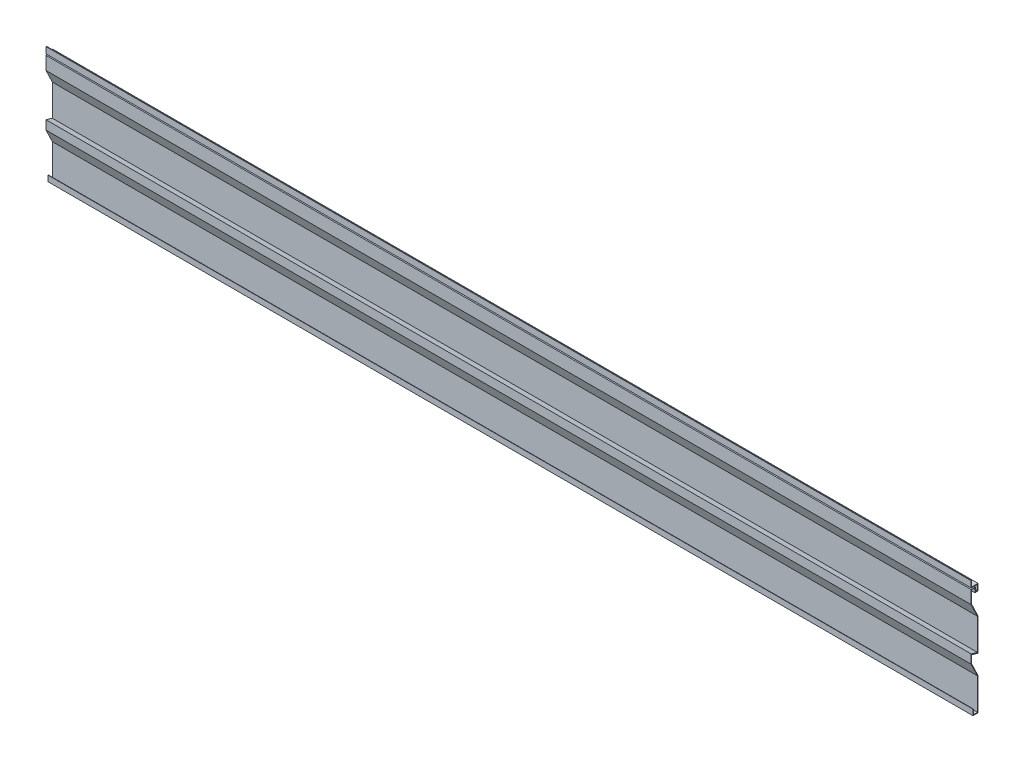
ISO-10303-21;
HEADER;
FILE_DESCRIPTION(('STEP AP214'),'2;1');
FILE_NAME('part.step','',(''),(''),'','','');
FILE_SCHEMA(('AUTOMOTIVE_DESIGN { 1 0 10303 214 1 1 1 1 }'));
ENDSEC;
DATA;
#1=APPLICATION_CONTEXT('core data for automotive mechanical design processes');
#2=APPLICATION_PROTOCOL_DEFINITION('international standard','automotive_design',2000,#1);
#3=PRODUCT_CONTEXT('',#1,'mechanical');
#4=PRODUCT('Part','Part','',(#3));
#5=PRODUCT_RELATED_PRODUCT_CATEGORY('part','',(#4));
#6=PRODUCT_DEFINITION_FORMATION('','',#4);
#7=PRODUCT_DEFINITION_CONTEXT('part definition',#1,'design');
#8=PRODUCT_DEFINITION('design','',#6,#7);
#9=PRODUCT_DEFINITION_SHAPE('','',#8);
#10=(LENGTH_UNIT() NAMED_UNIT(*) SI_UNIT(.MILLI.,.METRE.));
#11=(NAMED_UNIT(*) PLANE_ANGLE_UNIT() SI_UNIT($,.RADIAN.));
#12=(NAMED_UNIT(*) SI_UNIT($,.STERADIAN.) SOLID_ANGLE_UNIT());
#13=UNCERTAINTY_MEASURE_WITH_UNIT(LENGTH_MEASURE(1.E-05),#10,'distance_accuracy_value','');
#14=(GEOMETRIC_REPRESENTATION_CONTEXT(3) GLOBAL_UNCERTAINTY_ASSIGNED_CONTEXT((#13)) GLOBAL_UNIT_ASSIGNED_CONTEXT((#10,
#11,#12)) REPRESENTATION_CONTEXT('',''));
#15=CARTESIAN_POINT('',(0.,0.,0.));
#16=DIRECTION('',(0.,0.,1.));
#17=DIRECTION('',(1.,0.,0.));
#18=AXIS2_PLACEMENT_3D('',#15,#16,#17);
#19=CARTESIAN_POINT('',(1830.,-176.742770169573,21.0404628300535));
#20=DIRECTION('',(0.,0.,-1.));
#21=DIRECTION('',(-1.,0.,0.));
#22=AXIS2_PLACEMENT_3D('',#19,#20,#21);
#23=PLANE('',#22);
#24=DIRECTION('',(0.,-1.,0.));
#25=VECTOR('',#24,1.);
#26=CARTESIAN_POINT('',(0.,-176.742770169573,21.0404628300535));
#27=LINE('',#26,#25);
#28=CARTESIAN_POINT('',(0.,-165.442275203157,21.0404628300535));
#29=VERTEX_POINT('',#28);
#30=CARTESIAN_POINT('',(0.,-176.742770169573,21.0404628300535));
#31=VERTEX_POINT('',#30);
#32=EDGE_CURVE('E278',#29,#31,#27,.T.);
#33=ORIENTED_EDGE('',*,*,#32,.T.);
#34=DIRECTION('',(-1.,0.,0.));
#35=VECTOR('',#34,1.);
#36=CARTESIAN_POINT('',(1830.,-176.742770169573,21.0404628300535));
#37=LINE('',#36,#35);
#38=CARTESIAN_POINT('',(1830.,-176.742770169573,21.0404628300535));
#39=VERTEX_POINT('',#38);
#40=EDGE_CURVE('E11',#39,#31,#37,.T.);
#41=ORIENTED_EDGE('',*,*,#40,.F.);
#42=DIRECTION('',(0.,-1.,0.));
#43=VECTOR('',#42,1.);
#44=CARTESIAN_POINT('',(1830.,-176.742770169573,21.0404628300535));
#45=LINE('',#44,#43);
#46=CARTESIAN_POINT('',(1830.,-165.442275203157,21.0404628300535));
#47=VERTEX_POINT('',#46);
#48=EDGE_CURVE('E340',#47,#39,#45,.T.);
#49=ORIENTED_EDGE('',*,*,#48,.F.);
#50=DIRECTION('',(-1.,0.,0.));
#51=VECTOR('',#50,1.);
#52=CARTESIAN_POINT('',(1830.,-165.442275203157,21.0404628300535));
#53=LINE('',#52,#51);
#54=EDGE_CURVE('E274',#47,#29,#53,.T.);
#55=ORIENTED_EDGE('',*,*,#54,.T.);
#56=EDGE_LOOP('',(#33,#41,#49,#55));
#57=FACE_BOUND('',#56,.T.);
#58=ADVANCED_FACE('F38',(#57),#23,.F.);
#59=CARTESIAN_POINT('',(1830.,-176.742770169573,21.0404628300535));
#60=DIRECTION('',(0.,1.,0.));
#61=DIRECTION('',(0.,0.,1.));
#62=AXIS2_PLACEMENT_3D('',#59,#60,#61);
#63=PLANE('',#62);
#64=DIRECTION('',(0.,0.,-1.));
#65=VECTOR('',#64,1.);
#66=CARTESIAN_POINT('',(0.,-176.742770169573,21.0404628300535));
#67=LINE('',#66,#65);
#68=CARTESIAN_POINT('',(0.,-176.742770169573,11.0404628300535));
#69=VERTEX_POINT('',#68);
#70=EDGE_CURVE('E281',#31,#69,#67,.T.);
#71=ORIENTED_EDGE('',*,*,#70,.T.);
#72=DIRECTION('',(-1.,0.,0.));
#73=VECTOR('',#72,1.);
#74=CARTESIAN_POINT('',(1830.,-176.742770169573,11.0404628300535));
#75=LINE('',#74,#73);
#76=CARTESIAN_POINT('',(1830.,-176.742770169573,11.0404628300535));
#77=VERTEX_POINT('',#76);
#78=EDGE_CURVE('E46',#77,#69,#75,.T.);
#79=ORIENTED_EDGE('',*,*,#78,.F.);
#80=DIRECTION('',(0.,0.,-1.));
#81=VECTOR('',#80,1.);
#82=CARTESIAN_POINT('',(1830.,-176.742770169573,21.0404628300535));
#83=LINE('',#82,#81);
#84=EDGE_CURVE('E169',#39,#77,#83,.T.);
#85=ORIENTED_EDGE('',*,*,#84,.F.);
#86=ORIENTED_EDGE('',*,*,#40,.T.);
#87=EDGE_LOOP('',(#71,#79,#85,#86));
#88=FACE_BOUND('',#87,.T.);
#89=ADVANCED_FACE('F518',(#88),#63,.F.);
#90=CARTESIAN_POINT('',(1830.,-176.742770169573,11.0404628300535));
#91=DIRECTION('',(0.,0.,1.));
#92=DIRECTION('',(1.,0.,0.));
#93=AXIS2_PLACEMENT_3D('',#90,#91,#92);
#94=PLANE('',#93);
#95=DIRECTION('',(0.,1.,0.));
#96=VECTOR('',#95,1.);
#97=CARTESIAN_POINT('',(0.,-176.742770169573,11.0404628300535));
#98=LINE('',#97,#96);
#99=CARTESIAN_POINT('',(0.,-112.742770169573,11.0404628300535));
#100=VERTEX_POINT('',#99);
#101=EDGE_CURVE('E283',#69,#100,#98,.T.);
#102=ORIENTED_EDGE('',*,*,#101,.T.);
#103=DIRECTION('',(-1.,0.,0.));
#104=VECTOR('',#103,1.);
#105=CARTESIAN_POINT('',(1830.,-112.742770169573,11.0404628300535));
#106=LINE('',#105,#104);
#107=CARTESIAN_POINT('',(1830.,-112.742770169573,11.0404628300535));
#108=VERTEX_POINT('',#107);
#109=EDGE_CURVE('E419',#108,#100,#106,.T.);
#110=ORIENTED_EDGE('',*,*,#109,.F.);
#111=DIRECTION('',(0.,1.,0.));
#112=VECTOR('',#111,1.);
#113=CARTESIAN_POINT('',(1830.,-176.742770169573,11.0404628300535));
#114=LINE('',#113,#112);
#115=EDGE_CURVE('E427',#77,#108,#114,.T.);
#116=ORIENTED_EDGE('',*,*,#115,.F.);
#117=ORIENTED_EDGE('',*,*,#78,.T.);
#118=EDGE_LOOP('',(#102,#110,#116,#117));
#119=FACE_BOUND('',#118,.T.);
#120=ADVANCED_FACE('F425',(#119),#94,.F.);
#121=CARTESIAN_POINT('',(1830.,-112.742770169573,11.0404628300535));
#122=DIRECTION('',(0.,-0.430724047871383,0.902483681063148));
#123=DIRECTION('',(0.,-0.902483681063148,-0.430724047871383));
#124=AXIS2_PLACEMENT_3D('',#121,#122,#123);
#125=PLANE('',#124);
#126=DIRECTION('',(0.,0.902483681063148,0.430724047871383));
#127=VECTOR('',#126,1.);
#128=CARTESIAN_POINT('',(0.,-112.742770169573,11.0404628300535));
#129=LINE('',#128,#127);
#130=CARTESIAN_POINT('',(0.,-86.7468857968479,23.4473935923095));
#131=VERTEX_POINT('',#130);
#132=EDGE_CURVE('E285',#100,#131,#129,.T.);
#133=ORIENTED_EDGE('',*,*,#132,.T.);
#134=DIRECTION('',(-1.,0.,0.));
#135=VECTOR('',#134,1.);
#136=CARTESIAN_POINT('',(1830.,-86.7468857968479,23.4473935923095));
#137=LINE('',#136,#135);
#138=CARTESIAN_POINT('',(1830.,-86.7468857968479,23.4473935923095));
#139=VERTEX_POINT('',#138);
#140=EDGE_CURVE('E416',#139,#131,#137,.T.);
#141=ORIENTED_EDGE('',*,*,#140,.F.);
#142=DIRECTION('',(0.,0.902483681063148,0.430724047871383));
#143=VECTOR('',#142,1.);
#144=CARTESIAN_POINT('',(1830.,-112.742770169573,11.0404628300535));
#145=LINE('',#144,#143);
#146=EDGE_CURVE('E445',#108,#139,#145,.T.);
#147=ORIENTED_EDGE('',*,*,#146,.F.);
#148=ORIENTED_EDGE('',*,*,#109,.T.);
#149=EDGE_LOOP('',(#133,#141,#147,#148));
#150=FACE_BOUND('',#149,.T.);
#151=ADVANCED_FACE('F436',(#150),#125,.F.);
#152=CARTESIAN_POINT('',(1830.,-86.7468857968479,23.4473935923095));
#153=DIRECTION('',(0.,0.,1.));
#154=DIRECTION('',(1.,0.,0.));
#155=AXIS2_PLACEMENT_3D('',#152,#153,#154);
#156=PLANE('',#155);
#157=DIRECTION('',(0.,1.,0.));
#158=VECTOR('',#157,1.);
#159=CARTESIAN_POINT('',(0.,-86.7468857968479,23.4473935923095));
#160=LINE('',#159,#158);
#161=CARTESIAN_POINT('',(0.,-71.1496014100118,23.4473935923095));
#162=VERTEX_POINT('',#161);
#163=EDGE_CURVE('E287',#131,#162,#160,.T.);
#164=ORIENTED_EDGE('',*,*,#163,.T.);
#165=DIRECTION('',(-1.,0.,0.));
#166=VECTOR('',#165,1.);
#167=CARTESIAN_POINT('',(1830.,-71.1496014100118,23.4473935923095));
#168=LINE('',#167,#166);
#169=CARTESIAN_POINT('',(1830.,-71.1496014100118,23.4473935923095));
#170=VERTEX_POINT('',#169);
#171=EDGE_CURVE('E413',#170,#162,#168,.T.);
#172=ORIENTED_EDGE('',*,*,#171,.F.);
#173=DIRECTION('',(0.,1.,0.));
#174=VECTOR('',#173,1.);
#175=CARTESIAN_POINT('',(1830.,-86.7468857968479,23.4473935923095));
#176=LINE('',#175,#174);
#177=EDGE_CURVE('E442',#139,#170,#176,.T.);
#178=ORIENTED_EDGE('',*,*,#177,.F.);
#179=ORIENTED_EDGE('',*,*,#140,.T.);
#180=EDGE_LOOP('',(#164,#172,#178,#179));
#181=FACE_BOUND('',#180,.T.);
#182=ADVANCED_FACE('F440',(#181),#156,.F.);
#183=CARTESIAN_POINT('',(1830.,-71.1496014100118,23.4473935923095));
#184=DIRECTION('',(0.,0.961523947640823,-0.274721127897377));
#185=DIRECTION('',(0.,0.274721127897377,0.961523947640823));
#186=AXIS2_PLACEMENT_3D('',#183,#184,#185);
#187=PLANE('',#186);
#188=DIRECTION('',(0.,-0.274721127897377,-0.961523947640823));
#189=VECTOR('',#188,1.);
#190=CARTESIAN_POINT('',(0.,-71.1496014100118,23.4473935923095));
#191=LINE('',#190,#189);
#192=CARTESIAN_POINT('',(0.,-74.6944387706563,11.0404628300535));
#193=VERTEX_POINT('',#192);
#194=EDGE_CURVE('E289',#162,#193,#191,.T.);
#195=ORIENTED_EDGE('',*,*,#194,.T.);
#196=DIRECTION('',(-1.,0.,0.));
#197=VECTOR('',#196,1.);
#198=CARTESIAN_POINT('',(1830.,-74.6944387706563,11.0404628300535));
#199=LINE('',#198,#197);
#200=CARTESIAN_POINT('',(1830.,-74.6944387706563,11.0404628300535));
#201=VERTEX_POINT('',#200);
#202=EDGE_CURVE('E410',#201,#193,#199,.T.);
#203=ORIENTED_EDGE('',*,*,#202,.F.);
#204=DIRECTION('',(0.,-0.274721127897377,-0.961523947640823));
#205=VECTOR('',#204,1.);
#206=CARTESIAN_POINT('',(1830.,-71.1496014100118,23.4473935923095));
#207=LINE('',#206,#205);
#208=EDGE_CURVE('E444',#170,#201,#207,.T.);
#209=ORIENTED_EDGE('',*,*,#208,.F.);
#210=ORIENTED_EDGE('',*,*,#171,.T.);
#211=EDGE_LOOP('',(#195,#203,#209,#210));
#212=FACE_BOUND('',#211,.T.);
#213=ADVANCED_FACE('F531',(#212),#187,.F.);
#214=CARTESIAN_POINT('',(1830.,-74.6944387706563,11.0404628300535));
#215=DIRECTION('',(0.,0.,1.));
#216=DIRECTION('',(1.,0.,0.));
#217=AXIS2_PLACEMENT_3D('',#214,#215,#216);
#218=PLANE('',#217);
#219=DIRECTION('',(0.,1.,0.));
#220=VECTOR('',#219,1.);
#221=CARTESIAN_POINT('',(0.,-74.6944387706563,11.0404628300535));
#222=LINE('',#221,#220);
#223=CARTESIAN_POINT('',(0.,-10.6944387706563,11.0404628300535));
#224=VERTEX_POINT('',#223);
#225=EDGE_CURVE('E291',#193,#224,#222,.T.);
#226=ORIENTED_EDGE('',*,*,#225,.T.);
#227=DIRECTION('',(-1.,0.,0.));
#228=VECTOR('',#227,1.);
#229=CARTESIAN_POINT('',(1830.,-10.6944387706563,11.0404628300535));
#230=LINE('',#229,#228);
#231=CARTESIAN_POINT('',(1830.,-10.6944387706563,11.0404628300535));
#232=VERTEX_POINT('',#231);
#233=EDGE_CURVE('E407',#232,#224,#230,.T.);
#234=ORIENTED_EDGE('',*,*,#233,.F.);
#235=DIRECTION('',(0.,1.,0.));
#236=VECTOR('',#235,1.);
#237=CARTESIAN_POINT('',(1830.,-74.6944387706563,11.0404628300535));
#238=LINE('',#237,#236);
#239=EDGE_CURVE('E447',#201,#232,#238,.T.);
#240=ORIENTED_EDGE('',*,*,#239,.F.);
#241=ORIENTED_EDGE('',*,*,#202,.T.);
#242=EDGE_LOOP('',(#226,#234,#240,#241));
#243=FACE_BOUND('',#242,.T.);
#244=ADVANCED_FACE('F534',(#243),#218,.F.);
#245=CARTESIAN_POINT('',(1830.,-10.6944387706563,11.0404628300535));
#246=DIRECTION('',(0.,-0.430724047871383,0.902483681063148));
#247=DIRECTION('',(0.,-0.902483681063148,-0.430724047871384));
#248=AXIS2_PLACEMENT_3D('',#245,#246,#247);
#249=PLANE('',#248);
#250=DIRECTION('',(0.,0.902483681063148,0.430724047871383));
#251=VECTOR('',#250,1.);
#252=CARTESIAN_POINT('',(0.,-10.6944387706563,11.0404628300535));
#253=LINE('',#252,#251);
#254=CARTESIAN_POINT('',(0.,15.3014456020684,23.4473935923095));
#255=VERTEX_POINT('',#254);
#256=EDGE_CURVE('E293',#224,#255,#253,.T.);
#257=ORIENTED_EDGE('',*,*,#256,.T.);
#258=DIRECTION('',(-1.,0.,0.));
#259=VECTOR('',#258,1.);
#260=CARTESIAN_POINT('',(1830.,15.3014456020684,23.4473935923095));
#261=LINE('',#260,#259);
#262=CARTESIAN_POINT('',(1830.,15.3014456020684,23.4473935923095));
#263=VERTEX_POINT('',#262);
#264=EDGE_CURVE('E404',#263,#255,#261,.T.);
#265=ORIENTED_EDGE('',*,*,#264,.F.);
#266=DIRECTION('',(0.,0.902483681063148,0.430724047871383));
#267=VECTOR('',#266,1.);
#268=CARTESIAN_POINT('',(1830.,-10.6944387706563,11.0404628300535));
#269=LINE('',#268,#267);
#270=EDGE_CURVE('E453',#232,#263,#269,.T.);
#271=ORIENTED_EDGE('',*,*,#270,.F.);
#272=ORIENTED_EDGE('',*,*,#233,.T.);
#273=EDGE_LOOP('',(#257,#265,#271,#272));
#274=FACE_BOUND('',#273,.T.);
#275=ADVANCED_FACE('F538',(#274),#249,.F.);
#276=CARTESIAN_POINT('',(1830.,15.3014456020684,23.4473935923095));
#277=DIRECTION('',(0.,0.,1.));
#278=DIRECTION('',(1.,0.,0.));
#279=AXIS2_PLACEMENT_3D('',#276,#277,#278);
#280=PLANE('',#279);
#281=DIRECTION('',(0.,1.,0.));
#282=VECTOR('',#281,1.);
#283=CARTESIAN_POINT('',(0.,15.3014456020684,23.4473935923095));
#284=LINE('',#283,#282);
#285=CARTESIAN_POINT('',(0.,40.3055612293437,23.4473935923095));
#286=VERTEX_POINT('',#285);
#287=EDGE_CURVE('E295',#255,#286,#284,.T.);
#288=ORIENTED_EDGE('',*,*,#287,.T.);
#289=DIRECTION('',(-1.,0.,0.));
#290=VECTOR('',#289,1.);
#291=CARTESIAN_POINT('',(1830.,40.3055612293437,23.4473935923095));
#292=LINE('',#291,#290);
#293=CARTESIAN_POINT('',(1830.,40.3055612293437,23.4473935923095));
#294=VERTEX_POINT('',#293);
#295=EDGE_CURVE('E401',#294,#286,#292,.T.);
#296=ORIENTED_EDGE('',*,*,#295,.F.);
#297=DIRECTION('',(0.,1.,0.));
#298=VECTOR('',#297,1.);
#299=CARTESIAN_POINT('',(1830.,15.3014456020684,23.4473935923095));
#300=LINE('',#299,#298);
#301=EDGE_CURVE('E455',#263,#294,#300,.T.);
#302=ORIENTED_EDGE('',*,*,#301,.F.);
#303=ORIENTED_EDGE('',*,*,#264,.T.);
#304=EDGE_LOOP('',(#288,#296,#302,#303));
#305=FACE_BOUND('',#304,.T.);
#306=ADVANCED_FACE('F542',(#305),#280,.F.);
#307=CARTESIAN_POINT('',(1830.,40.3055612293437,23.4473935923095));
#308=DIRECTION('',(0.,1.,0.));
#309=DIRECTION('',(0.,0.,1.));
#310=AXIS2_PLACEMENT_3D('',#307,#308,#309);
#311=PLANE('',#310);
#312=DIRECTION('',(0.,0.,-1.));
#313=VECTOR('',#312,1.);
#314=CARTESIAN_POINT('',(0.,40.3055612293437,23.4473935923095));
#315=LINE('',#314,#313);
#316=CARTESIAN_POINT('',(0.,40.3055612293437,17.2439282111815));
#317=VERTEX_POINT('',#316);
#318=EDGE_CURVE('E297',#286,#317,#315,.T.);
#319=ORIENTED_EDGE('',*,*,#318,.T.);
#320=DIRECTION('',(-1.,0.,0.));
#321=VECTOR('',#320,1.);
#322=CARTESIAN_POINT('',(1830.,40.3055612293437,17.2439282111815));
#323=LINE('',#322,#321);
#324=CARTESIAN_POINT('',(1830.,40.3055612293437,17.2439282111815));
#325=VERTEX_POINT('',#324);
#326=EDGE_CURVE('E398',#325,#317,#323,.T.);
#327=ORIENTED_EDGE('',*,*,#326,.F.);
#328=DIRECTION('',(0.,0.,-1.));
#329=VECTOR('',#328,1.);
#330=CARTESIAN_POINT('',(1830.,40.3055612293437,23.4473935923095));
#331=LINE('',#330,#329);
#332=EDGE_CURVE('E457',#294,#325,#331,.T.);
#333=ORIENTED_EDGE('',*,*,#332,.F.);
#334=ORIENTED_EDGE('',*,*,#295,.T.);
#335=EDGE_LOOP('',(#319,#327,#333,#334));
#336=FACE_BOUND('',#335,.T.);
#337=ADVANCED_FACE('F546',(#336),#311,.F.);
#338=CARTESIAN_POINT('',(1830.,40.3055612293437,17.2439282111815));
#339=DIRECTION('',(0.,0.,-1.));
#340=DIRECTION('',(-1.,0.,0.));
#341=AXIS2_PLACEMENT_3D('',#338,#339,#340);
#342=PLANE('',#341);
#343=DIRECTION('',(0.,-1.,0.));
#344=VECTOR('',#343,1.);
#345=CARTESIAN_POINT('',(0.,40.3055612293437,17.2439282111815));
#346=LINE('',#345,#344);
#347=CARTESIAN_POINT('',(0.,32.0051657847453,17.2439282111815));
#348=VERTEX_POINT('',#347);
#349=EDGE_CURVE('E299',#317,#348,#346,.T.);
#350=ORIENTED_EDGE('',*,*,#349,.T.);
#351=DIRECTION('',(-1.,0.,0.));
#352=VECTOR('',#351,1.);
#353=CARTESIAN_POINT('',(1830.,32.0051657847453,17.2439282111815));
#354=LINE('',#353,#352);
#355=CARTESIAN_POINT('',(1830.,32.0051657847453,17.2439282111815));
#356=VERTEX_POINT('',#355);
#357=EDGE_CURVE('E395',#356,#348,#354,.T.);
#358=ORIENTED_EDGE('',*,*,#357,.F.);
#359=DIRECTION('',(0.,-1.,0.));
#360=VECTOR('',#359,1.);
#361=CARTESIAN_POINT('',(1830.,40.3055612293437,17.2439282111815));
#362=LINE('',#361,#360);
#363=EDGE_CURVE('E459',#325,#356,#362,.T.);
#364=ORIENTED_EDGE('',*,*,#363,.F.);
#365=ORIENTED_EDGE('',*,*,#326,.T.);
#366=EDGE_LOOP('',(#350,#358,#364,#365));
#367=FACE_BOUND('',#366,.T.);
#368=ADVANCED_FACE('F550',(#367),#342,.F.);
#369=CARTESIAN_POINT('',(1830.,32.0051657847453,17.2439282111815));
#370=DIRECTION('',(0.,1.,0.));
#371=DIRECTION('',(0.,0.,1.));
#372=AXIS2_PLACEMENT_3D('',#369,#370,#371);
#373=PLANE('',#372);
#374=DIRECTION('',(0.,0.,-1.));
#375=VECTOR('',#374,1.);
#376=CARTESIAN_POINT('',(0.,32.0051657847453,17.2439282111815));
#377=LINE('',#376,#375);
#378=CARTESIAN_POINT('',(0.,32.0051657847453,11.0404628300535));
#379=VERTEX_POINT('',#378);
#380=EDGE_CURVE('E301',#348,#379,#377,.T.);
#381=ORIENTED_EDGE('',*,*,#380,.T.);
#382=DIRECTION('',(-1.,0.,0.));
#383=VECTOR('',#382,1.);
#384=CARTESIAN_POINT('',(1830.,32.0051657847453,11.0404628300535));
#385=LINE('',#384,#383);
#386=CARTESIAN_POINT('',(1830.,32.0051657847453,11.0404628300535));
#387=VERTEX_POINT('',#386);
#388=EDGE_CURVE('E392',#387,#379,#385,.T.);
#389=ORIENTED_EDGE('',*,*,#388,.F.);
#390=DIRECTION('',(0.,0.,-1.));
#391=VECTOR('',#390,1.);
#392=CARTESIAN_POINT('',(1830.,32.0051657847453,17.2439282111815));
#393=LINE('',#392,#391);
#394=EDGE_CURVE('E461',#356,#387,#393,.T.);
#395=ORIENTED_EDGE('',*,*,#394,.F.);
#396=ORIENTED_EDGE('',*,*,#357,.T.);
#397=EDGE_LOOP('',(#381,#389,#395,#396));
#398=FACE_BOUND('',#397,.T.);
#399=ADVANCED_FACE('F554',(#398),#373,.F.);
#400=CARTESIAN_POINT('',(1830.,32.0051657847453,11.0404628300535));
#401=DIRECTION('',(0.,0.,1.));
#402=DIRECTION('',(1.,0.,0.));
#403=AXIS2_PLACEMENT_3D('',#400,#401,#402);
#404=PLANE('',#403);
#405=DIRECTION('',(0.,1.,0.));
#406=VECTOR('',#405,1.);
#407=CARTESIAN_POINT('',(0.,32.0051657847453,11.0404628300535));
#408=LINE('',#407,#406);
#409=CARTESIAN_POINT('',(0.,45.1210640191303,11.0404628300535));
#410=VERTEX_POINT('',#409);
#411=EDGE_CURVE('E303',#379,#410,#408,.T.);
#412=ORIENTED_EDGE('',*,*,#411,.T.);
#413=DIRECTION('',(-1.,0.,0.));
#414=VECTOR('',#413,1.);
#415=CARTESIAN_POINT('',(1830.,45.1210640191303,11.0404628300535));
#416=LINE('',#415,#414);
#417=CARTESIAN_POINT('',(1830.,45.1210640191303,11.0404628300535));
#418=VERTEX_POINT('',#417);
#419=EDGE_CURVE('E389',#418,#410,#416,.T.);
#420=ORIENTED_EDGE('',*,*,#419,.F.);
#421=DIRECTION('',(0.,1.,0.));
#422=VECTOR('',#421,1.);
#423=CARTESIAN_POINT('',(1830.,32.0051657847453,11.0404628300535));
#424=LINE('',#423,#422);
#425=EDGE_CURVE('E463',#387,#418,#424,.T.);
#426=ORIENTED_EDGE('',*,*,#425,.F.);
#427=ORIENTED_EDGE('',*,*,#388,.T.);
#428=EDGE_LOOP('',(#412,#420,#426,#427));
#429=FACE_BOUND('',#428,.T.);
#430=ADVANCED_FACE('F558',(#429),#404,.F.);
#431=CARTESIAN_POINT('',(1830.,45.1210640191303,11.0404628300535));
#432=DIRECTION('',(0.,-1.,0.));
#433=DIRECTION('',(0.,0.,-1.));
#434=AXIS2_PLACEMENT_3D('',#431,#432,#433);
#435=PLANE('',#434);
#436=DIRECTION('',(0.,0.,1.));
#437=VECTOR('',#436,1.);
#438=CARTESIAN_POINT('',(0.,45.1210640191303,11.0404628300535));
#439=LINE('',#438,#437);
#440=CARTESIAN_POINT('',(0.,45.1210640191303,23.4473935923095));
#441=VERTEX_POINT('',#440);
#442=EDGE_CURVE('E305',#410,#441,#439,.T.);
#443=ORIENTED_EDGE('',*,*,#442,.T.);
#444=DIRECTION('',(-1.,0.,0.));
#445=VECTOR('',#444,1.);
#446=CARTESIAN_POINT('',(1830.,45.1210640191303,23.4473935923095));
#447=LINE('',#446,#445);
#448=CARTESIAN_POINT('',(1830.,45.1210640191303,23.4473935923095));
#449=VERTEX_POINT('',#448);
#450=EDGE_CURVE('E386',#449,#441,#447,.T.);
#451=ORIENTED_EDGE('',*,*,#450,.F.);
#452=DIRECTION('',(0.,0.,1.));
#453=VECTOR('',#452,1.);
#454=CARTESIAN_POINT('',(1830.,45.1210640191303,11.0404628300535));
#455=LINE('',#454,#453);
#456=EDGE_CURVE('E465',#418,#449,#455,.T.);
#457=ORIENTED_EDGE('',*,*,#456,.F.);
#458=ORIENTED_EDGE('',*,*,#419,.T.);
#459=EDGE_LOOP('',(#443,#451,#457,#458));
#460=FACE_BOUND('',#459,.T.);
#461=ADVANCED_FACE('F562',(#460),#435,.F.);
#462=CARTESIAN_POINT('',(1830.,45.1210640191303,23.4473935923095));
#463=DIRECTION('',(0.,0.,1.));
#464=DIRECTION('',(1.,0.,0.));
#465=AXIS2_PLACEMENT_3D('',#462,#463,#464);
#466=PLANE('',#465);
#467=DIRECTION('',(0.,1.,0.));
#468=VECTOR('',#467,1.);
#469=CARTESIAN_POINT('',(0.,45.1210640191303,23.4473935923095));
#470=LINE('',#469,#468);
#471=CARTESIAN_POINT('',(0.,56.3055612293437,23.4473935923095));
#472=VERTEX_POINT('',#471);
#473=EDGE_CURVE('E307',#441,#472,#470,.T.);
#474=ORIENTED_EDGE('',*,*,#473,.T.);
#475=DIRECTION('',(-1.,0.,0.));
#476=VECTOR('',#475,1.);
#477=CARTESIAN_POINT('',(1830.,56.3055612293437,23.4473935923095));
#478=LINE('',#477,#476);
#479=CARTESIAN_POINT('',(1830.,56.3055612293437,23.4473935923095));
#480=VERTEX_POINT('',#479);
#481=EDGE_CURVE('E383',#480,#472,#478,.T.);
#482=ORIENTED_EDGE('',*,*,#481,.F.);
#483=DIRECTION('',(0.,1.,0.));
#484=VECTOR('',#483,1.);
#485=CARTESIAN_POINT('',(1830.,45.1210640191303,23.4473935923095));
#486=LINE('',#485,#484);
#487=EDGE_CURVE('E467',#449,#480,#486,.T.);
#488=ORIENTED_EDGE('',*,*,#487,.F.);
#489=ORIENTED_EDGE('',*,*,#450,.T.);
#490=EDGE_LOOP('',(#474,#482,#488,#489));
#491=FACE_BOUND('',#490,.T.);
#492=ADVANCED_FACE('F566',(#491),#466,.F.);
#493=CARTESIAN_POINT('',(1830.,56.3055612293437,24.5071196606439));
#494=DIRECTION('',(0.,-1.,0.));
#495=DIRECTION('',(0.,0.,-1.));
#496=AXIS2_PLACEMENT_3D('',#493,#494,#495);
#497=PLANE('',#496);
#498=DIRECTION('',(0.,0.,1.));
#499=VECTOR('',#498,1.);
#500=CARTESIAN_POINT('',(0.,56.3055612293437,24.5071196606439));
#501=LINE('',#500,#499);
#502=CARTESIAN_POINT('',(0.,56.3055612293437,24.5071196606439));
#503=VERTEX_POINT('',#502);
#504=EDGE_CURVE('E309',#472,#503,#501,.T.);
#505=ORIENTED_EDGE('',*,*,#504,.T.);
#506=DIRECTION('',(-1.,0.,0.));
#507=VECTOR('',#506,1.);
#508=CARTESIAN_POINT('',(1830.,56.3055612293437,24.5071196606439));
#509=LINE('',#508,#507);
#510=CARTESIAN_POINT('',(1830.,56.3055612293437,24.5071196606439));
#511=VERTEX_POINT('',#510);
#512=EDGE_CURVE('E380',#511,#503,#509,.T.);
#513=ORIENTED_EDGE('',*,*,#512,.F.);
#514=DIRECTION('',(0.,0.,1.));
#515=VECTOR('',#514,1.);
#516=CARTESIAN_POINT('',(1830.,56.3055612293437,24.5071196606439));
#517=LINE('',#516,#515);
#518=EDGE_CURVE('E469',#480,#511,#517,.T.);
#519=ORIENTED_EDGE('',*,*,#518,.F.);
#520=ORIENTED_EDGE('',*,*,#481,.T.);
#521=EDGE_LOOP('',(#505,#513,#519,#520));
#522=FACE_BOUND('',#521,.T.);
#523=ADVANCED_FACE('F570',(#522),#497,.F.);
#524=CARTESIAN_POINT('',(1830.,43.8204378839902,24.5071196606439));
#525=DIRECTION('',(0.,0.,-1.));
#526=DIRECTION('',(-1.,0.,0.));
#527=AXIS2_PLACEMENT_3D('',#524,#525,#526);
#528=PLANE('',#527);
#529=DIRECTION('',(0.,-1.,0.));
#530=VECTOR('',#529,1.);
#531=CARTESIAN_POINT('',(0.,43.8204378839902,24.5071196606439));
#532=LINE('',#531,#530);
#533=CARTESIAN_POINT('',(0.,43.8204378839902,24.5071196606439));
#534=VERTEX_POINT('',#533);
#535=EDGE_CURVE('E311',#503,#534,#532,.T.);
#536=ORIENTED_EDGE('',*,*,#535,.T.);
#537=DIRECTION('',(-1.,0.,0.));
#538=VECTOR('',#537,1.);
#539=CARTESIAN_POINT('',(1830.,43.8204378839902,24.5071196606439));
#540=LINE('',#539,#538);
#541=CARTESIAN_POINT('',(1830.,43.8204378839902,24.5071196606439));
#542=VERTEX_POINT('',#541);
#543=EDGE_CURVE('E377',#542,#534,#540,.T.);
#544=ORIENTED_EDGE('',*,*,#543,.F.);
#545=DIRECTION('',(0.,-1.,0.));
#546=VECTOR('',#545,1.);
#547=CARTESIAN_POINT('',(1830.,43.8204378839902,24.5071196606439));
#548=LINE('',#547,#546);
#549=EDGE_CURVE('E471',#511,#542,#548,.T.);
#550=ORIENTED_EDGE('',*,*,#549,.F.);
#551=ORIENTED_EDGE('',*,*,#512,.T.);
#552=EDGE_LOOP('',(#536,#544,#550,#551));
#553=FACE_BOUND('',#552,.T.);
#554=ADVANCED_FACE('F574',(#553),#528,.F.);
#555=CARTESIAN_POINT('',(1830.,43.8204378839902,12.1001888983879));
#556=DIRECTION('',(0.,1.,0.));
#557=DIRECTION('',(0.,0.,1.));
#558=AXIS2_PLACEMENT_3D('',#555,#556,#557);
#559=PLANE('',#558);
#560=DIRECTION('',(0.,0.,-1.));
#561=VECTOR('',#560,1.);
#562=CARTESIAN_POINT('',(0.,43.8204378839902,12.1001888983879));
#563=LINE('',#562,#561);
#564=CARTESIAN_POINT('',(0.,43.8204378839902,12.1001888983879));
#565=VERTEX_POINT('',#564);
#566=EDGE_CURVE('E313',#534,#565,#563,.T.);
#567=ORIENTED_EDGE('',*,*,#566,.T.);
#568=DIRECTION('',(-1.,0.,0.));
#569=VECTOR('',#568,1.);
#570=CARTESIAN_POINT('',(1830.,43.8204378839902,12.1001888983879));
#571=LINE('',#570,#569);
#572=CARTESIAN_POINT('',(1830.,43.8204378839902,12.1001888983879));
#573=VERTEX_POINT('',#572);
#574=EDGE_CURVE('E374',#573,#565,#571,.T.);
#575=ORIENTED_EDGE('',*,*,#574,.F.);
#576=DIRECTION('',(0.,0.,-1.));
#577=VECTOR('',#576,1.);
#578=CARTESIAN_POINT('',(1830.,43.8204378839902,12.1001888983879));
#579=LINE('',#578,#577);
#580=EDGE_CURVE('E473',#542,#573,#579,.T.);
#581=ORIENTED_EDGE('',*,*,#580,.F.);
#582=ORIENTED_EDGE('',*,*,#543,.T.);
#583=EDGE_LOOP('',(#567,#575,#581,#582));
#584=FACE_BOUND('',#583,.T.);
#585=ADVANCED_FACE('F578',(#584),#559,.F.);
#586=CARTESIAN_POINT('',(1830.,33.361087921631,12.1001888983879));
#587=DIRECTION('',(0.,0.,-1.));
#588=DIRECTION('',(-1.,0.,0.));
#589=AXIS2_PLACEMENT_3D('',#586,#587,#588);
#590=PLANE('',#589);
#591=DIRECTION('',(0.,-1.,0.));
#592=VECTOR('',#591,1.);
#593=CARTESIAN_POINT('',(0.,33.361087921631,12.1001888983879));
#594=LINE('',#593,#592);
#595=CARTESIAN_POINT('',(0.,33.361087921631,12.1001888983879));
#596=VERTEX_POINT('',#595);
#597=EDGE_CURVE('E315',#565,#596,#594,.T.);
#598=ORIENTED_EDGE('',*,*,#597,.T.);
#599=DIRECTION('',(-1.,0.,0.));
#600=VECTOR('',#599,1.);
#601=CARTESIAN_POINT('',(1830.,33.361087921631,12.1001888983879));
#602=LINE('',#601,#600);
#603=CARTESIAN_POINT('',(1830.,33.361087921631,12.1001888983879));
#604=VERTEX_POINT('',#603);
#605=EDGE_CURVE('E371',#604,#596,#602,.T.);
#606=ORIENTED_EDGE('',*,*,#605,.F.);
#607=DIRECTION('',(0.,-1.,0.));
#608=VECTOR('',#607,1.);
#609=CARTESIAN_POINT('',(1830.,33.361087921631,12.1001888983879));
#610=LINE('',#609,#608);
#611=EDGE_CURVE('E475',#573,#604,#610,.T.);
#612=ORIENTED_EDGE('',*,*,#611,.F.);
#613=ORIENTED_EDGE('',*,*,#574,.T.);
#614=EDGE_LOOP('',(#598,#606,#612,#613));
#615=FACE_BOUND('',#614,.T.);
#616=ADVANCED_FACE('F582',(#615),#590,.F.);
#617=CARTESIAN_POINT('',(1830.,33.361087921631,16.2229249000667));
#618=DIRECTION('',(0.,-1.,0.));
#619=DIRECTION('',(0.,0.,-1.));
#620=AXIS2_PLACEMENT_3D('',#617,#618,#619);
#621=PLANE('',#620);
#622=DIRECTION('',(0.,0.,1.));
#623=VECTOR('',#622,1.);
#624=CARTESIAN_POINT('',(0.,33.361087921631,16.2229249000667));
#625=LINE('',#624,#623);
#626=CARTESIAN_POINT('',(0.,33.361087921631,16.2229249000667));
#627=VERTEX_POINT('',#626);
#628=EDGE_CURVE('E317',#596,#627,#625,.T.);
#629=ORIENTED_EDGE('',*,*,#628,.T.);
#630=DIRECTION('',(-1.,0.,0.));
#631=VECTOR('',#630,1.);
#632=CARTESIAN_POINT('',(1830.,33.361087921631,16.2229249000667));
#633=LINE('',#632,#631);
#634=CARTESIAN_POINT('',(1830.,33.361087921631,16.2229249000667));
#635=VERTEX_POINT('',#634);
#636=EDGE_CURVE('E368',#635,#627,#633,.T.);
#637=ORIENTED_EDGE('',*,*,#636,.F.);
#638=DIRECTION('',(0.,0.,1.));
#639=VECTOR('',#638,1.);
#640=CARTESIAN_POINT('',(1830.,33.361087921631,16.2229249000667));
#641=LINE('',#640,#639);
#642=EDGE_CURVE('E477',#604,#635,#641,.T.);
#643=ORIENTED_EDGE('',*,*,#642,.F.);
#644=ORIENTED_EDGE('',*,*,#605,.T.);
#645=EDGE_LOOP('',(#629,#637,#643,#644));
#646=FACE_BOUND('',#645,.T.);
#647=ADVANCED_FACE('F586',(#646),#621,.F.);
#648=CARTESIAN_POINT('',(1830.,41.2325574809322,16.2229249000667));
#649=DIRECTION('',(0.,0.,1.));
#650=DIRECTION('',(1.,0.,0.));
#651=AXIS2_PLACEMENT_3D('',#648,#649,#650);
#652=PLANE('',#651);
#653=DIRECTION('',(0.,1.,0.));
#654=VECTOR('',#653,1.);
#655=CARTESIAN_POINT('',(0.,41.2325574809322,16.2229249000667));
#656=LINE('',#655,#654);
#657=CARTESIAN_POINT('',(0.,41.2325574809322,16.2229249000667));
#658=VERTEX_POINT('',#657);
#659=EDGE_CURVE('E319',#627,#658,#656,.T.);
#660=ORIENTED_EDGE('',*,*,#659,.T.);
#661=DIRECTION('',(-1.,0.,0.));
#662=VECTOR('',#661,1.);
#663=CARTESIAN_POINT('',(1830.,41.2325574809322,16.2229249000667));
#664=LINE('',#663,#662);
#665=CARTESIAN_POINT('',(1830.,41.2325574809322,16.2229249000667));
#666=VERTEX_POINT('',#665);
#667=EDGE_CURVE('E365',#666,#658,#664,.T.);
#668=ORIENTED_EDGE('',*,*,#667,.F.);
#669=DIRECTION('',(0.,1.,0.));
#670=VECTOR('',#669,1.);
#671=CARTESIAN_POINT('',(1830.,41.2325574809322,16.2229249000667));
#672=LINE('',#671,#670);
#673=EDGE_CURVE('E479',#635,#666,#672,.T.);
#674=ORIENTED_EDGE('',*,*,#673,.F.);
#675=ORIENTED_EDGE('',*,*,#636,.T.);
#676=EDGE_LOOP('',(#660,#668,#674,#675));
#677=FACE_BOUND('',#676,.T.);
#678=ADVANCED_FACE('F590',(#677),#652,.F.);
#679=CARTESIAN_POINT('',(1830.,41.2325574809322,24.5071196606439));
#680=DIRECTION('',(0.,-1.,0.));
#681=DIRECTION('',(0.,0.,-1.));
#682=AXIS2_PLACEMENT_3D('',#679,#680,#681);
#683=PLANE('',#682);
#684=DIRECTION('',(0.,0.,1.));
#685=VECTOR('',#684,1.);
#686=CARTESIAN_POINT('',(0.,41.2325574809322,24.5071196606439));
#687=LINE('',#686,#685);
#688=CARTESIAN_POINT('',(0.,41.2325574809322,24.5071196606439));
#689=VERTEX_POINT('',#688);
#690=EDGE_CURVE('E321',#658,#689,#687,.T.);
#691=ORIENTED_EDGE('',*,*,#690,.T.);
#692=DIRECTION('',(-1.,0.,0.));
#693=VECTOR('',#692,1.);
#694=CARTESIAN_POINT('',(1830.,41.2325574809322,24.5071196606439));
#695=LINE('',#694,#693);
#696=CARTESIAN_POINT('',(1830.,41.2325574809322,24.5071196606439));
#697=VERTEX_POINT('',#696);
#698=EDGE_CURVE('E362',#697,#689,#695,.T.);
#699=ORIENTED_EDGE('',*,*,#698,.F.);
#700=DIRECTION('',(0.,0.,1.));
#701=VECTOR('',#700,1.);
#702=CARTESIAN_POINT('',(1830.,41.2325574809322,24.5071196606439));
#703=LINE('',#702,#701);
#704=EDGE_CURVE('E481',#666,#697,#703,.T.);
#705=ORIENTED_EDGE('',*,*,#704,.F.);
#706=ORIENTED_EDGE('',*,*,#667,.T.);
#707=EDGE_LOOP('',(#691,#699,#705,#706));
#708=FACE_BOUND('',#707,.T.);
#709=ADVANCED_FACE('F594',(#708),#683,.F.);
#710=CARTESIAN_POINT('',(1830.,15.3014456020684,24.5071196606439));
#711=DIRECTION('',(0.,0.,-1.));
#712=DIRECTION('',(-1.,0.,0.));
#713=AXIS2_PLACEMENT_3D('',#710,#711,#712);
#714=PLANE('',#713);
#715=DIRECTION('',(0.,-1.,0.));
#716=VECTOR('',#715,1.);
#717=CARTESIAN_POINT('',(0.,15.3014456020684,24.5071196606439));
#718=LINE('',#717,#716);
#719=CARTESIAN_POINT('',(0.,15.3014456020684,24.5071196606439));
#720=VERTEX_POINT('',#719);
#721=EDGE_CURVE('E323',#689,#720,#718,.T.);
#722=ORIENTED_EDGE('',*,*,#721,.T.);
#723=DIRECTION('',(-1.,0.,0.));
#724=VECTOR('',#723,1.);
#725=CARTESIAN_POINT('',(1830.,15.3014456020684,24.5071196606439));
#726=LINE('',#725,#724);
#727=CARTESIAN_POINT('',(1830.,15.3014456020684,24.5071196606439));
#728=VERTEX_POINT('',#727);
#729=EDGE_CURVE('E359',#728,#720,#726,.T.);
#730=ORIENTED_EDGE('',*,*,#729,.F.);
#731=DIRECTION('',(0.,-1.,0.));
#732=VECTOR('',#731,1.);
#733=CARTESIAN_POINT('',(1830.,15.3014456020684,24.5071196606439));
#734=LINE('',#733,#732);
#735=EDGE_CURVE('E483',#697,#728,#734,.T.);
#736=ORIENTED_EDGE('',*,*,#735,.F.);
#737=ORIENTED_EDGE('',*,*,#698,.T.);
#738=EDGE_LOOP('',(#722,#730,#736,#737));
#739=FACE_BOUND('',#738,.T.);
#740=ADVANCED_FACE('F598',(#739),#714,.F.);
#741=CARTESIAN_POINT('',(1830.,-10.6944387706563,12.1001888983879));
#742=DIRECTION('',(0.,0.430724047871383,-0.902483681063148));
#743=DIRECTION('',(0.,0.902483681063148,0.430724047871384));
#744=AXIS2_PLACEMENT_3D('',#741,#742,#743);
#745=PLANE('',#744);
#746=DIRECTION('',(0.,-0.902483681063148,-0.430724047871383));
#747=VECTOR('',#746,1.);
#748=CARTESIAN_POINT('',(0.,-10.6944387706563,12.1001888983879));
#749=LINE('',#748,#747);
#750=CARTESIAN_POINT('',(0.,-10.6944387706563,12.1001888983879));
#751=VERTEX_POINT('',#750);
#752=EDGE_CURVE('E325',#720,#751,#749,.T.);
#753=ORIENTED_EDGE('',*,*,#752,.T.);
#754=DIRECTION('',(-1.,0.,0.));
#755=VECTOR('',#754,1.);
#756=CARTESIAN_POINT('',(1830.,-10.6944387706563,12.1001888983879));
#757=LINE('',#756,#755);
#758=CARTESIAN_POINT('',(1830.,-10.6944387706563,12.1001888983879));
#759=VERTEX_POINT('',#758);
#760=EDGE_CURVE('E356',#759,#751,#757,.T.);
#761=ORIENTED_EDGE('',*,*,#760,.F.);
#762=DIRECTION('',(0.,-0.902483681063148,-0.430724047871383));
#763=VECTOR('',#762,1.);
#764=CARTESIAN_POINT('',(1830.,-10.6944387706563,12.1001888983879));
#765=LINE('',#764,#763);
#766=EDGE_CURVE('E485',#728,#759,#765,.T.);
#767=ORIENTED_EDGE('',*,*,#766,.F.);
#768=ORIENTED_EDGE('',*,*,#729,.T.);
#769=EDGE_LOOP('',(#753,#761,#767,#768));
#770=FACE_BOUND('',#769,.T.);
#771=ADVANCED_FACE('F602',(#770),#745,.F.);
#772=CARTESIAN_POINT('',(1830.,-72.620716314859,12.1001888983879));
#773=DIRECTION('',(0.,0.,-1.));
#774=DIRECTION('',(-1.,0.,0.));
#775=AXIS2_PLACEMENT_3D('',#772,#773,#774);
#776=PLANE('',#775);
#777=DIRECTION('',(0.,-1.,0.));
#778=VECTOR('',#777,1.);
#779=CARTESIAN_POINT('',(0.,-72.620716314859,12.1001888983879));
#780=LINE('',#779,#778);
#781=CARTESIAN_POINT('',(0.,-72.620716314859,12.1001888983879));
#782=VERTEX_POINT('',#781);
#783=EDGE_CURVE('E327',#751,#782,#780,.T.);
#784=ORIENTED_EDGE('',*,*,#783,.T.);
#785=DIRECTION('',(-1.,0.,0.));
#786=VECTOR('',#785,1.);
#787=CARTESIAN_POINT('',(1830.,-72.620716314859,12.1001888983879));
#788=LINE('',#787,#786);
#789=CARTESIAN_POINT('',(1830.,-72.620716314859,12.1001888983879));
#790=VERTEX_POINT('',#789);
#791=EDGE_CURVE('E353',#790,#782,#788,.T.);
#792=ORIENTED_EDGE('',*,*,#791,.F.);
#793=DIRECTION('',(0.,-1.,0.));
#794=VECTOR('',#793,1.);
#795=CARTESIAN_POINT('',(1830.,-72.620716314859,12.1001888983879));
#796=LINE('',#795,#794);
#797=EDGE_CURVE('E487',#759,#790,#796,.T.);
#798=ORIENTED_EDGE('',*,*,#797,.F.);
#799=ORIENTED_EDGE('',*,*,#760,.T.);
#800=EDGE_LOOP('',(#784,#792,#798,#799));
#801=FACE_BOUND('',#800,.T.);
#802=ADVANCED_FACE('F606',(#801),#776,.F.);
#803=CARTESIAN_POINT('',(1830.,-69.0758789542145,24.5071196606439));
#804=DIRECTION('',(0.,-0.961523947640823,0.274721127897377));
#805=DIRECTION('',(0.,-0.274721127897377,-0.961523947640823));
#806=AXIS2_PLACEMENT_3D('',#803,#804,#805);
#807=PLANE('',#806);
#808=DIRECTION('',(0.,0.274721127897377,0.961523947640823));
#809=VECTOR('',#808,1.);
#810=CARTESIAN_POINT('',(0.,-69.0758789542145,24.5071196606439));
#811=LINE('',#810,#809);
#812=CARTESIAN_POINT('',(0.,-69.0758789542145,24.5071196606439));
#813=VERTEX_POINT('',#812);
#814=EDGE_CURVE('E329',#782,#813,#811,.T.);
#815=ORIENTED_EDGE('',*,*,#814,.T.);
#816=DIRECTION('',(-1.,0.,0.));
#817=VECTOR('',#816,1.);
#818=CARTESIAN_POINT('',(1830.,-69.0758789542145,24.5071196606439));
#819=LINE('',#818,#817);
#820=CARTESIAN_POINT('',(1830.,-69.0758789542145,24.5071196606439));
#821=VERTEX_POINT('',#820);
#822=EDGE_CURVE('E350',#821,#813,#819,.T.);
#823=ORIENTED_EDGE('',*,*,#822,.F.);
#824=DIRECTION('',(0.,0.274721127897377,0.961523947640823));
#825=VECTOR('',#824,1.);
#826=CARTESIAN_POINT('',(1830.,-69.0758789542145,24.5071196606439));
#827=LINE('',#826,#825);
#828=EDGE_CURVE('E489',#790,#821,#827,.T.);
#829=ORIENTED_EDGE('',*,*,#828,.F.);
#830=ORIENTED_EDGE('',*,*,#791,.T.);
#831=EDGE_LOOP('',(#815,#823,#829,#830));
#832=FACE_BOUND('',#831,.T.);
#833=ADVANCED_FACE('F610',(#832),#807,.F.);
#834=CARTESIAN_POINT('',(1830.,-86.7468857968479,24.5071196606439));
#835=DIRECTION('',(0.,0.,-1.));
#836=DIRECTION('',(-1.,0.,0.));
#837=AXIS2_PLACEMENT_3D('',#834,#835,#836);
#838=PLANE('',#837);
#839=DIRECTION('',(0.,-1.,0.));
#840=VECTOR('',#839,1.);
#841=CARTESIAN_POINT('',(0.,-86.7468857968479,24.5071196606439));
#842=LINE('',#841,#840);
#843=CARTESIAN_POINT('',(0.,-86.7468857968479,24.5071196606439));
#844=VERTEX_POINT('',#843);
#845=EDGE_CURVE('E331',#813,#844,#842,.T.);
#846=ORIENTED_EDGE('',*,*,#845,.T.);
#847=DIRECTION('',(-1.,0.,0.));
#848=VECTOR('',#847,1.);
#849=CARTESIAN_POINT('',(1830.,-86.7468857968479,24.5071196606439));
#850=LINE('',#849,#848);
#851=CARTESIAN_POINT('',(1830.,-86.7468857968479,24.5071196606439));
#852=VERTEX_POINT('',#851);
#853=EDGE_CURVE('E347',#852,#844,#850,.T.);
#854=ORIENTED_EDGE('',*,*,#853,.F.);
#855=DIRECTION('',(0.,-1.,0.));
#856=VECTOR('',#855,1.);
#857=CARTESIAN_POINT('',(1830.,-86.7468857968479,24.5071196606439));
#858=LINE('',#857,#856);
#859=EDGE_CURVE('E491',#821,#852,#858,.T.);
#860=ORIENTED_EDGE('',*,*,#859,.F.);
#861=ORIENTED_EDGE('',*,*,#822,.T.);
#862=EDGE_LOOP('',(#846,#854,#860,#861));
#863=FACE_BOUND('',#862,.T.);
#864=ADVANCED_FACE('F614',(#863),#838,.F.);
#865=CARTESIAN_POINT('',(1830.,-112.742770169573,12.1001888983879));
#866=DIRECTION('',(0.,0.430724047871383,-0.902483681063148));
#867=DIRECTION('',(0.,0.902483681063148,0.430724047871383));
#868=AXIS2_PLACEMENT_3D('',#865,#866,#867);
#869=PLANE('',#868);
#870=DIRECTION('',(0.,-0.902483681063148,-0.430724047871383));
#871=VECTOR('',#870,1.);
#872=CARTESIAN_POINT('',(0.,-112.742770169573,12.1001888983879));
#873=LINE('',#872,#871);
#874=CARTESIAN_POINT('',(0.,-112.742770169573,12.1001888983879));
#875=VERTEX_POINT('',#874);
#876=EDGE_CURVE('E333',#844,#875,#873,.T.);
#877=ORIENTED_EDGE('',*,*,#876,.T.);
#878=DIRECTION('',(-1.,0.,0.));
#879=VECTOR('',#878,1.);
#880=CARTESIAN_POINT('',(1830.,-112.742770169573,12.1001888983879));
#881=LINE('',#880,#879);
#882=CARTESIAN_POINT('',(1830.,-112.742770169573,12.1001888983879));
#883=VERTEX_POINT('',#882);
#884=EDGE_CURVE('E344',#883,#875,#881,.T.);
#885=ORIENTED_EDGE('',*,*,#884,.F.);
#886=DIRECTION('',(0.,-0.902483681063148,-0.430724047871383));
#887=VECTOR('',#886,1.);
#888=CARTESIAN_POINT('',(1830.,-112.742770169573,12.1001888983879));
#889=LINE('',#888,#887);
#890=EDGE_CURVE('E493',#852,#883,#889,.T.);
#891=ORIENTED_EDGE('',*,*,#890,.F.);
#892=ORIENTED_EDGE('',*,*,#853,.T.);
#893=EDGE_LOOP('',(#877,#885,#891,#892));
#894=FACE_BOUND('',#893,.T.);
#895=ADVANCED_FACE('F499',(#894),#869,.F.);
#896=CARTESIAN_POINT('',(1830.,-175.263961292871,12.1001888983879));
#897=DIRECTION('',(0.,0.,-1.));
#898=DIRECTION('',(-1.,0.,0.));
#899=AXIS2_PLACEMENT_3D('',#896,#897,#898);
#900=PLANE('',#899);
#901=DIRECTION('',(0.,-1.,0.));
#902=VECTOR('',#901,1.);
#903=CARTESIAN_POINT('',(0.,-175.263961292871,12.1001888983879));
#904=LINE('',#903,#902);
#905=CARTESIAN_POINT('',(0.,-175.263961292871,12.1001888983879));
#906=VERTEX_POINT('',#905);
#907=EDGE_CURVE('E335',#875,#906,#904,.T.);
#908=ORIENTED_EDGE('',*,*,#907,.T.);
#909=DIRECTION('',(-1.,0.,0.));
#910=VECTOR('',#909,1.);
#911=CARTESIAN_POINT('',(1830.,-175.263961292871,12.1001888983879));
#912=LINE('',#911,#910);
#913=CARTESIAN_POINT('',(1830.,-175.263961292871,12.1001888983879));
#914=VERTEX_POINT('',#913);
#915=EDGE_CURVE('E269',#914,#906,#912,.T.);
#916=ORIENTED_EDGE('',*,*,#915,.F.);
#917=DIRECTION('',(0.,-1.,0.));
#918=VECTOR('',#917,1.);
#919=CARTESIAN_POINT('',(1830.,-175.263961292871,12.1001888983879));
#920=LINE('',#919,#918);
#921=EDGE_CURVE('E260',#883,#914,#920,.T.);
#922=ORIENTED_EDGE('',*,*,#921,.F.);
#923=ORIENTED_EDGE('',*,*,#884,.T.);
#924=EDGE_LOOP('',(#908,#916,#922,#923));
#925=FACE_BOUND('',#924,.T.);
#926=ADVANCED_FACE('F503',(#925),#900,.F.);
#927=CARTESIAN_POINT('',(1830.,-175.263961292871,20.3456609017455));
#928=DIRECTION('',(0.,-1.,0.));
#929=DIRECTION('',(0.,0.,-1.));
#930=AXIS2_PLACEMENT_3D('',#927,#928,#929);
#931=PLANE('',#930);
#932=DIRECTION('',(0.,0.,1.));
#933=VECTOR('',#932,1.);
#934=CARTESIAN_POINT('',(0.,-175.263961292871,20.3456609017455));
#935=LINE('',#934,#933);
#936=CARTESIAN_POINT('',(0.,-175.263961292871,20.3456609017455));
#937=VERTEX_POINT('',#936);
#938=EDGE_CURVE('E268',#906,#937,#935,.T.);
#939=ORIENTED_EDGE('',*,*,#938,.T.);
#940=DIRECTION('',(-1.,0.,0.));
#941=VECTOR('',#940,1.);
#942=CARTESIAN_POINT('',(1830.,-175.263961292871,20.3456609017455));
#943=LINE('',#942,#941);
#944=CARTESIAN_POINT('',(1830.,-175.263961292871,20.3456609017455));
#945=VERTEX_POINT('',#944);
#946=EDGE_CURVE('E265',#945,#937,#943,.T.);
#947=ORIENTED_EDGE('',*,*,#946,.F.);
#948=DIRECTION('',(0.,0.,1.));
#949=VECTOR('',#948,1.);
#950=CARTESIAN_POINT('',(1830.,-175.263961292871,20.3456609017455));
#951=LINE('',#950,#949);
#952=EDGE_CURVE('E254',#914,#945,#951,.T.);
#953=ORIENTED_EDGE('',*,*,#952,.F.);
#954=ORIENTED_EDGE('',*,*,#915,.T.);
#955=EDGE_LOOP('',(#939,#947,#953,#954));
#956=FACE_BOUND('',#955,.T.);
#957=ADVANCED_FACE('F266',(#956),#931,.F.);
#958=CARTESIAN_POINT('',(1830.,-165.442275203157,20.3456609017455));
#959=DIRECTION('',(0.,0.,1.));
#960=DIRECTION('',(1.,0.,0.));
#961=AXIS2_PLACEMENT_3D('',#958,#959,#960);
#962=PLANE('',#961);
#963=DIRECTION('',(0.,1.,0.));
#964=VECTOR('',#963,1.);
#965=CARTESIAN_POINT('',(0.,-165.442275203157,20.3456609017455));
#966=LINE('',#965,#964);
#967=CARTESIAN_POINT('',(0.,-165.442275203157,20.3456609017455));
#968=VERTEX_POINT('',#967);
#969=EDGE_CURVE('E155',#937,#968,#966,.T.);
#970=ORIENTED_EDGE('',*,*,#969,.T.);
#971=DIRECTION('',(-1.,0.,0.));
#972=VECTOR('',#971,1.);
#973=CARTESIAN_POINT('',(1830.,-165.442275203157,20.3456609017455));
#974=LINE('',#973,#972);
#975=CARTESIAN_POINT('',(1830.,-165.442275203157,20.3456609017455));
#976=VERTEX_POINT('',#975);
#977=EDGE_CURVE('E270',#976,#968,#974,.T.);
#978=ORIENTED_EDGE('',*,*,#977,.F.);
#979=DIRECTION('',(0.,1.,0.));
#980=VECTOR('',#979,1.);
#981=CARTESIAN_POINT('',(1830.,-165.442275203157,20.3456609017455));
#982=LINE('',#981,#980);
#983=EDGE_CURVE('E258',#945,#976,#982,.T.);
#984=ORIENTED_EDGE('',*,*,#983,.F.);
#985=ORIENTED_EDGE('',*,*,#946,.T.);
#986=EDGE_LOOP('',(#970,#978,#984,#985));
#987=FACE_BOUND('',#986,.T.);
#988=ADVANCED_FACE('F272',(#987),#962,.F.);
#989=CARTESIAN_POINT('',(1830.,-165.442275203157,21.0404628300535));
#990=DIRECTION('',(0.,-1.,0.));
#991=DIRECTION('',(0.,0.,-1.));
#992=AXIS2_PLACEMENT_3D('',#989,#990,#991);
#993=PLANE('',#992);
#994=DIRECTION('',(0.,0.,1.));
#995=VECTOR('',#994,1.);
#996=CARTESIAN_POINT('',(0.,-165.442275203157,21.0404628300535));
#997=LINE('',#996,#995);
#998=EDGE_CURVE('E161',#968,#29,#997,.T.);
#999=ORIENTED_EDGE('',*,*,#998,.T.);
#1000=ORIENTED_EDGE('',*,*,#54,.F.);
#1001=DIRECTION('',(0.,0.,1.));
#1002=VECTOR('',#1001,1.);
#1003=CARTESIAN_POINT('',(1830.,-165.442275203157,21.0404628300535));
#1004=LINE('',#1003,#1002);
#1005=EDGE_CURVE('E54',#976,#47,#1004,.T.);
#1006=ORIENTED_EDGE('',*,*,#1005,.F.);
#1007=ORIENTED_EDGE('',*,*,#977,.T.);
#1008=EDGE_LOOP('',(#999,#1000,#1006,#1007));
#1009=FACE_BOUND('',#1008,.T.);
#1010=ADVANCED_FACE('F507',(#1009),#993,.F.);
#1011=CARTESIAN_POINT('',(1830.,0.,0.));
#1012=DIRECTION('',(-1.,0.,0.));
#1013=DIRECTION('',(0.,0.,1.));
#1014=AXIS2_PLACEMENT_3D('',#1011,#1012,#1013);
#1015=PLANE('',#1014);
#1016=ORIENTED_EDGE('',*,*,#48,.T.);
#1017=ORIENTED_EDGE('',*,*,#84,.T.);
#1018=ORIENTED_EDGE('',*,*,#115,.T.);
#1019=ORIENTED_EDGE('',*,*,#146,.T.);
#1020=ORIENTED_EDGE('',*,*,#177,.T.);
#1021=ORIENTED_EDGE('',*,*,#208,.T.);
#1022=ORIENTED_EDGE('',*,*,#239,.T.);
#1023=ORIENTED_EDGE('',*,*,#270,.T.);
#1024=ORIENTED_EDGE('',*,*,#301,.T.);
#1025=ORIENTED_EDGE('',*,*,#332,.T.);
#1026=ORIENTED_EDGE('',*,*,#363,.T.);
#1027=ORIENTED_EDGE('',*,*,#394,.T.);
#1028=ORIENTED_EDGE('',*,*,#425,.T.);
#1029=ORIENTED_EDGE('',*,*,#456,.T.);
#1030=ORIENTED_EDGE('',*,*,#487,.T.);
#1031=ORIENTED_EDGE('',*,*,#518,.T.);
#1032=ORIENTED_EDGE('',*,*,#549,.T.);
#1033=ORIENTED_EDGE('',*,*,#580,.T.);
#1034=ORIENTED_EDGE('',*,*,#611,.T.);
#1035=ORIENTED_EDGE('',*,*,#642,.T.);
#1036=ORIENTED_EDGE('',*,*,#673,.T.);
#1037=ORIENTED_EDGE('',*,*,#704,.T.);
#1038=ORIENTED_EDGE('',*,*,#735,.T.);
#1039=ORIENTED_EDGE('',*,*,#766,.T.);
#1040=ORIENTED_EDGE('',*,*,#797,.T.);
#1041=ORIENTED_EDGE('',*,*,#828,.T.);
#1042=ORIENTED_EDGE('',*,*,#859,.T.);
#1043=ORIENTED_EDGE('',*,*,#890,.T.);
#1044=ORIENTED_EDGE('',*,*,#921,.T.);
#1045=ORIENTED_EDGE('',*,*,#952,.T.);
#1046=ORIENTED_EDGE('',*,*,#983,.T.);
#1047=ORIENTED_EDGE('',*,*,#1005,.T.);
#1048=EDGE_LOOP('',(#1016,#1017,#1018,#1019,#1020,#1021,#1022,#1023,#1024,#1025,#1026,#1027,
#1028,#1029,#1030,#1031,#1032,#1033,#1034,#1035,#1036,#1037,#1038,#1039,#1040,#1041,#1042,#1043,
#1044,#1045,#1046,#1047));
#1049=FACE_BOUND('',#1048,.T.);
#1050=ADVANCED_FACE('F256',(#1049),#1015,.F.);
#1051=CARTESIAN_POINT('',(0.,0.,0.));
#1052=DIRECTION('',(-1.,0.,0.));
#1053=DIRECTION('',(0.,0.,1.));
#1054=AXIS2_PLACEMENT_3D('',#1051,#1052,#1053);
#1055=PLANE('',#1054);
#1056=ORIENTED_EDGE('',*,*,#32,.F.);
#1057=ORIENTED_EDGE('',*,*,#998,.F.);
#1058=ORIENTED_EDGE('',*,*,#969,.F.);
#1059=ORIENTED_EDGE('',*,*,#938,.F.);
#1060=ORIENTED_EDGE('',*,*,#907,.F.);
#1061=ORIENTED_EDGE('',*,*,#876,.F.);
#1062=ORIENTED_EDGE('',*,*,#845,.F.);
#1063=ORIENTED_EDGE('',*,*,#814,.F.);
#1064=ORIENTED_EDGE('',*,*,#783,.F.);
#1065=ORIENTED_EDGE('',*,*,#752,.F.);
#1066=ORIENTED_EDGE('',*,*,#721,.F.);
#1067=ORIENTED_EDGE('',*,*,#690,.F.);
#1068=ORIENTED_EDGE('',*,*,#659,.F.);
#1069=ORIENTED_EDGE('',*,*,#628,.F.);
#1070=ORIENTED_EDGE('',*,*,#597,.F.);
#1071=ORIENTED_EDGE('',*,*,#566,.F.);
#1072=ORIENTED_EDGE('',*,*,#535,.F.);
#1073=ORIENTED_EDGE('',*,*,#504,.F.);
#1074=ORIENTED_EDGE('',*,*,#473,.F.);
#1075=ORIENTED_EDGE('',*,*,#442,.F.);
#1076=ORIENTED_EDGE('',*,*,#411,.F.);
#1077=ORIENTED_EDGE('',*,*,#380,.F.);
#1078=ORIENTED_EDGE('',*,*,#349,.F.);
#1079=ORIENTED_EDGE('',*,*,#318,.F.);
#1080=ORIENTED_EDGE('',*,*,#287,.F.);
#1081=ORIENTED_EDGE('',*,*,#256,.F.);
#1082=ORIENTED_EDGE('',*,*,#225,.F.);
#1083=ORIENTED_EDGE('',*,*,#194,.F.);
#1084=ORIENTED_EDGE('',*,*,#163,.F.);
#1085=ORIENTED_EDGE('',*,*,#132,.F.);
#1086=ORIENTED_EDGE('',*,*,#101,.F.);
#1087=ORIENTED_EDGE('',*,*,#70,.F.);
#1088=EDGE_LOOP('',(#1056,#1057,#1058,#1059,#1060,#1061,#1062,#1063,#1064,#1065,#1066,#1067,
#1068,#1069,#1070,#1071,#1072,#1073,#1074,#1075,#1076,#1077,#1078,#1079,#1080,#1081,#1082,#1083,
#1084,#1085,#1086,#1087));
#1089=FACE_BOUND('',#1088,.T.);
#1090=ADVANCED_FACE('F431',(#1089),#1055,.T.);
#1091=CLOSED_SHELL('',(#58,#89,#120,#151,#182,#213,#244,#275,#306,#337,#368,#399,#430,#461,#492,
#523,#554,#585,#616,#647,#678,#709,#740,#771,#802,#833,#864,#895,#926,#957,#988,#1010,#1050,#1090));
#1092=MANIFOLD_SOLID_BREP('B2',#1091);
#1093=ADVANCED_BREP_SHAPE_REPRESENTATION('',(#18,#1092),#14);
#1094=SHAPE_DEFINITION_REPRESENTATION(#9,#1093);
ENDSEC;
END-ISO-10303-21;
